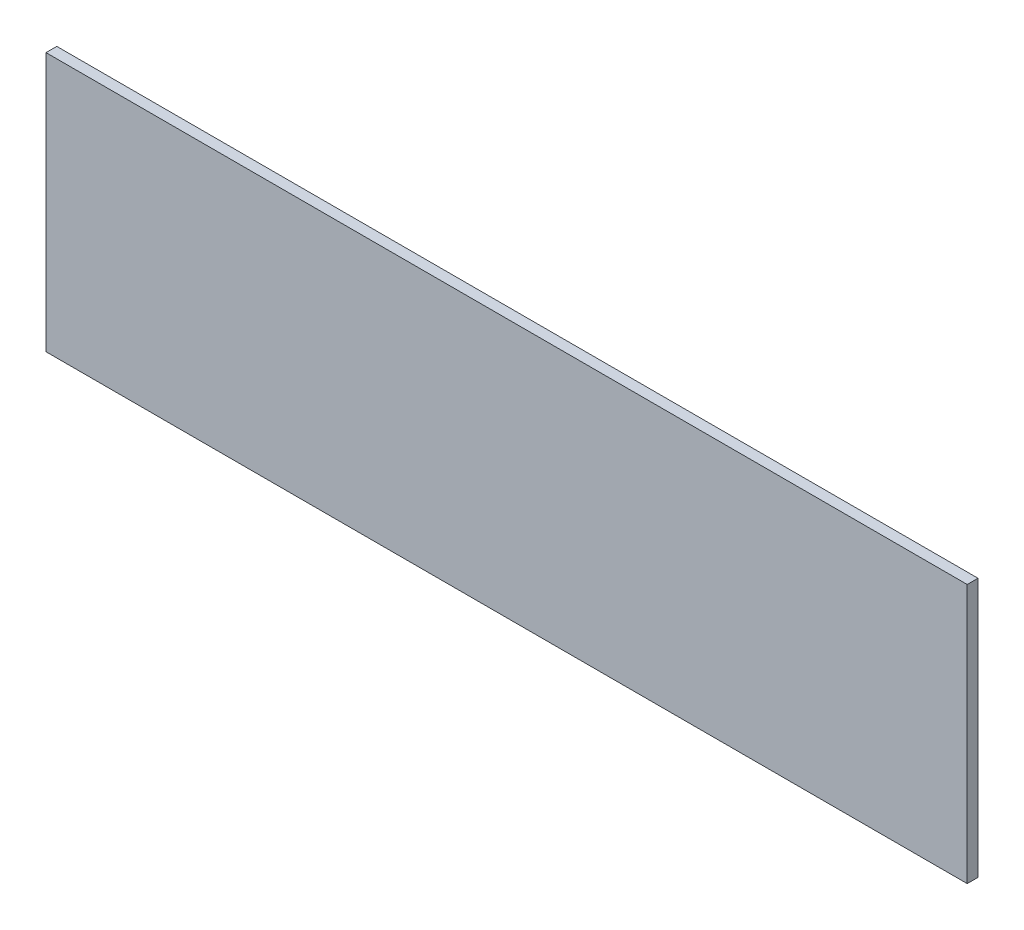
ISO-10303-21;
HEADER;
FILE_DESCRIPTION(('STEP AP214'),'2;1');
FILE_NAME('part.step','',(''),(''),'','','');
FILE_SCHEMA(('AUTOMOTIVE_DESIGN { 1 0 10303 214 1 1 1 1 }'));
ENDSEC;
DATA;
#1=APPLICATION_CONTEXT('core data for automotive mechanical design processes');
#2=APPLICATION_PROTOCOL_DEFINITION('international standard','automotive_design',2000,#1);
#3=PRODUCT_CONTEXT('',#1,'mechanical');
#4=PRODUCT('Part','Part','',(#3));
#5=PRODUCT_RELATED_PRODUCT_CATEGORY('part','',(#4));
#6=PRODUCT_DEFINITION_FORMATION('','',#4);
#7=PRODUCT_DEFINITION_CONTEXT('part definition',#1,'design');
#8=PRODUCT_DEFINITION('design','',#6,#7);
#9=PRODUCT_DEFINITION_SHAPE('','',#8);
#10=(LENGTH_UNIT() NAMED_UNIT(*) SI_UNIT(.MILLI.,.METRE.));
#11=(NAMED_UNIT(*) PLANE_ANGLE_UNIT() SI_UNIT($,.RADIAN.));
#12=(NAMED_UNIT(*) SI_UNIT($,.STERADIAN.) SOLID_ANGLE_UNIT());
#13=UNCERTAINTY_MEASURE_WITH_UNIT(LENGTH_MEASURE(1.E-05),#10,'distance_accuracy_value','');
#14=(GEOMETRIC_REPRESENTATION_CONTEXT(3) GLOBAL_UNCERTAINTY_ASSIGNED_CONTEXT((#13)) GLOBAL_UNIT_ASSIGNED_CONTEXT((#10,
#11,#12)) REPRESENTATION_CONTEXT('',''));
#15=CARTESIAN_POINT('',(0.,0.,0.));
#16=DIRECTION('',(0.,0.,1.));
#17=DIRECTION('',(1.,0.,0.));
#18=AXIS2_PLACEMENT_3D('',#15,#16,#17);
#19=CARTESIAN_POINT('',(0.,0.,4.7625));
#20=DIRECTION('',(1.,0.,0.));
#21=DIRECTION('',(0.,0.,-1.));
#22=AXIS2_PLACEMENT_3D('',#19,#20,#21);
#23=PLANE('',#22);
#24=DIRECTION('',(0.,-1.,0.));
#25=VECTOR('',#24,1.);
#26=CARTESIAN_POINT('',(0.,0.,0.));
#27=LINE('',#26,#25);
#28=CARTESIAN_POINT('',(0.,114.3,0.));
#29=VERTEX_POINT('',#28);
#30=CARTESIAN_POINT('',(0.,0.,0.));
#31=VERTEX_POINT('',#30);
#32=EDGE_CURVE('E107',#29,#31,#27,.T.);
#33=ORIENTED_EDGE('',*,*,#32,.T.);
#34=DIRECTION('',(0.,0.,-1.));
#35=VECTOR('',#34,1.);
#36=CARTESIAN_POINT('',(0.,0.,4.7625));
#37=LINE('',#36,#35);
#38=CARTESIAN_POINT('',(0.,0.,4.7625));
#39=VERTEX_POINT('',#38);
#40=EDGE_CURVE('E11',#39,#31,#37,.T.);
#41=ORIENTED_EDGE('',*,*,#40,.F.);
#42=DIRECTION('',(0.,-1.,0.));
#43=VECTOR('',#42,1.);
#44=CARTESIAN_POINT('',(0.,0.,4.7625));
#45=LINE('',#44,#43);
#46=CARTESIAN_POINT('',(0.,114.3,4.7625));
#47=VERTEX_POINT('',#46);
#48=EDGE_CURVE('E91',#47,#39,#45,.T.);
#49=ORIENTED_EDGE('',*,*,#48,.F.);
#50=DIRECTION('',(0.,0.,-1.));
#51=VECTOR('',#50,1.);
#52=CARTESIAN_POINT('',(0.,114.3,4.7625));
#53=LINE('',#52,#51);
#54=EDGE_CURVE('E103',#47,#29,#53,.T.);
#55=ORIENTED_EDGE('',*,*,#54,.T.);
#56=EDGE_LOOP('',(#33,#41,#49,#55));
#57=FACE_BOUND('',#56,.T.);
#58=ADVANCED_FACE('F39',(#57),#23,.F.);
#59=CARTESIAN_POINT('',(0.,0.,4.7625));
#60=DIRECTION('',(0.,1.,0.));
#61=DIRECTION('',(0.,0.,1.));
#62=AXIS2_PLACEMENT_3D('',#59,#60,#61);
#63=PLANE('',#62);
#64=DIRECTION('',(1.,0.,0.));
#65=VECTOR('',#64,1.);
#66=CARTESIAN_POINT('',(0.,0.,0.));
#67=LINE('',#66,#65);
#68=CARTESIAN_POINT('',(406.4,0.,0.));
#69=VERTEX_POINT('',#68);
#70=EDGE_CURVE('E96',#31,#69,#67,.T.);
#71=ORIENTED_EDGE('',*,*,#70,.T.);
#72=DIRECTION('',(0.,0.,-1.));
#73=VECTOR('',#72,1.);
#74=CARTESIAN_POINT('',(406.4,0.,4.7625));
#75=LINE('',#74,#73);
#76=CARTESIAN_POINT('',(406.4,0.,4.7625));
#77=VERTEX_POINT('',#76);
#78=EDGE_CURVE('E48',#77,#69,#75,.T.);
#79=ORIENTED_EDGE('',*,*,#78,.F.);
#80=DIRECTION('',(1.,0.,0.));
#81=VECTOR('',#80,1.);
#82=CARTESIAN_POINT('',(0.,0.,4.7625));
#83=LINE('',#82,#81);
#84=EDGE_CURVE('E86',#39,#77,#83,.T.);
#85=ORIENTED_EDGE('',*,*,#84,.F.);
#86=ORIENTED_EDGE('',*,*,#40,.T.);
#87=EDGE_LOOP('',(#71,#79,#85,#86));
#88=FACE_BOUND('',#87,.T.);
#89=ADVANCED_FACE('F95',(#88),#63,.F.);
#90=CARTESIAN_POINT('',(406.4,0.,4.7625));
#91=DIRECTION('',(-1.,0.,0.));
#92=DIRECTION('',(0.,0.,1.));
#93=AXIS2_PLACEMENT_3D('',#90,#91,#92);
#94=PLANE('',#93);
#95=DIRECTION('',(0.,1.,0.));
#96=VECTOR('',#95,1.);
#97=CARTESIAN_POINT('',(406.4,0.,0.));
#98=LINE('',#97,#96);
#99=CARTESIAN_POINT('',(406.4,114.3,0.));
#100=VERTEX_POINT('',#99);
#101=EDGE_CURVE('E73',#69,#100,#98,.T.);
#102=ORIENTED_EDGE('',*,*,#101,.T.);
#103=DIRECTION('',(0.,0.,-1.));
#104=VECTOR('',#103,1.);
#105=CARTESIAN_POINT('',(406.4,114.3,4.7625));
#106=LINE('',#105,#104);
#107=CARTESIAN_POINT('',(406.4,114.3,4.7625));
#108=VERTEX_POINT('',#107);
#109=EDGE_CURVE('E98',#108,#100,#106,.T.);
#110=ORIENTED_EDGE('',*,*,#109,.F.);
#111=DIRECTION('',(0.,1.,0.));
#112=VECTOR('',#111,1.);
#113=CARTESIAN_POINT('',(406.4,0.,4.7625));
#114=LINE('',#113,#112);
#115=EDGE_CURVE('E89',#77,#108,#114,.T.);
#116=ORIENTED_EDGE('',*,*,#115,.F.);
#117=ORIENTED_EDGE('',*,*,#78,.T.);
#118=EDGE_LOOP('',(#102,#110,#116,#117));
#119=FACE_BOUND('',#118,.T.);
#120=ADVANCED_FACE('F99',(#119),#94,.F.);
#121=CARTESIAN_POINT('',(0.,114.3,4.7625));
#122=DIRECTION('',(0.,-1.,0.));
#123=DIRECTION('',(0.,0.,-1.));
#124=AXIS2_PLACEMENT_3D('',#121,#122,#123);
#125=PLANE('',#124);
#126=DIRECTION('',(-1.,0.,0.));
#127=VECTOR('',#126,1.);
#128=CARTESIAN_POINT('',(0.,114.3,0.));
#129=LINE('',#128,#127);
#130=EDGE_CURVE('E79',#100,#29,#129,.T.);
#131=ORIENTED_EDGE('',*,*,#130,.T.);
#132=ORIENTED_EDGE('',*,*,#54,.F.);
#133=DIRECTION('',(-1.,0.,0.));
#134=VECTOR('',#133,1.);
#135=CARTESIAN_POINT('',(0.,114.3,4.7625));
#136=LINE('',#135,#134);
#137=EDGE_CURVE('E56',#108,#47,#136,.T.);
#138=ORIENTED_EDGE('',*,*,#137,.F.);
#139=ORIENTED_EDGE('',*,*,#109,.T.);
#140=EDGE_LOOP('',(#131,#132,#138,#139));
#141=FACE_BOUND('',#140,.T.);
#142=ADVANCED_FACE('F120',(#141),#125,.F.);
#143=CARTESIAN_POINT('',(0.,0.,4.7625));
#144=DIRECTION('',(0.,0.,-1.));
#145=DIRECTION('',(-1.,0.,0.));
#146=AXIS2_PLACEMENT_3D('',#143,#144,#145);
#147=PLANE('',#146);
#148=ORIENTED_EDGE('',*,*,#48,.T.);
#149=ORIENTED_EDGE('',*,*,#84,.T.);
#150=ORIENTED_EDGE('',*,*,#115,.T.);
#151=ORIENTED_EDGE('',*,*,#137,.T.);
#152=EDGE_LOOP('',(#148,#149,#150,#151));
#153=FACE_BOUND('',#152,.T.);
#154=ADVANCED_FACE('F87',(#153),#147,.F.);
#155=CARTESIAN_POINT('',(0.,0.,0.));
#156=DIRECTION('',(0.,0.,-1.));
#157=DIRECTION('',(-1.,0.,0.));
#158=AXIS2_PLACEMENT_3D('',#155,#156,#157);
#159=PLANE('',#158);
#160=ORIENTED_EDGE('',*,*,#32,.F.);
#161=ORIENTED_EDGE('',*,*,#130,.F.);
#162=ORIENTED_EDGE('',*,*,#101,.F.);
#163=ORIENTED_EDGE('',*,*,#70,.F.);
#164=EDGE_LOOP('',(#160,#161,#162,#163));
#165=FACE_BOUND('',#164,.T.);
#166=ADVANCED_FACE('F123',(#165),#159,.T.);
#167=CLOSED_SHELL('',(#58,#89,#120,#142,#154,#166));
#168=MANIFOLD_SOLID_BREP('B2',#167);
#169=ADVANCED_BREP_SHAPE_REPRESENTATION('',(#18,#168),#14);
#170=SHAPE_DEFINITION_REPRESENTATION(#9,#169);
ENDSEC;
END-ISO-10303-21;
